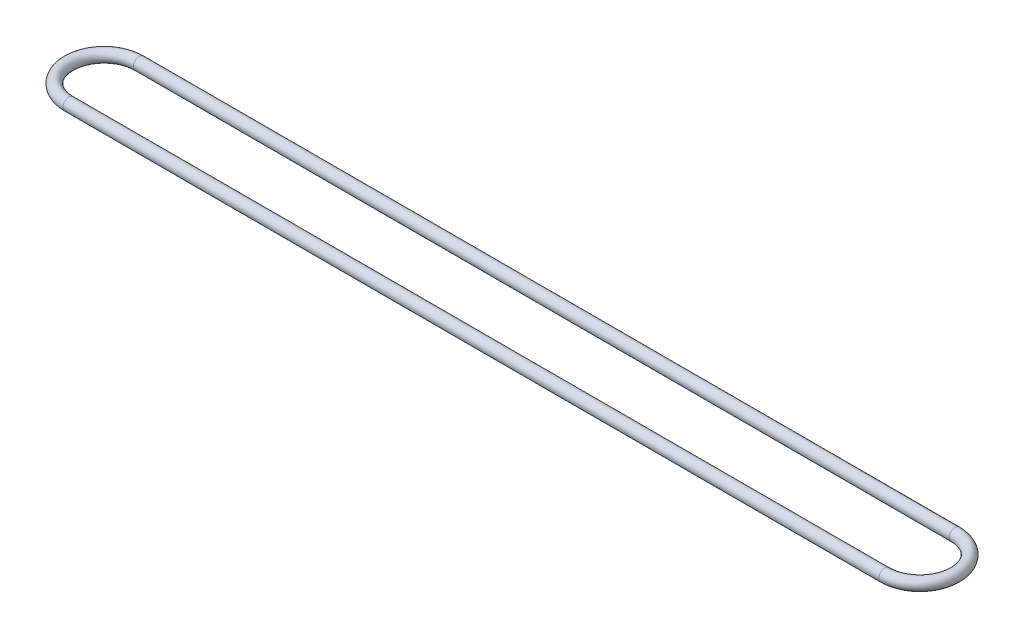
ISO-10303-21;
HEADER;
FILE_DESCRIPTION(('STEP AP214'),'2;1');
FILE_NAME('part.step','',(''),(''),'','','');
FILE_SCHEMA(('AUTOMOTIVE_DESIGN { 1 0 10303 214 1 1 1 1 }'));
ENDSEC;
DATA;
#1=APPLICATION_CONTEXT('core data for automotive mechanical design processes');
#2=APPLICATION_PROTOCOL_DEFINITION('international standard','automotive_design',2000,#1);
#3=PRODUCT_CONTEXT('',#1,'mechanical');
#4=PRODUCT('Part','Part','',(#3));
#5=PRODUCT_RELATED_PRODUCT_CATEGORY('part','',(#4));
#6=PRODUCT_DEFINITION_FORMATION('','',#4);
#7=PRODUCT_DEFINITION_CONTEXT('part definition',#1,'design');
#8=PRODUCT_DEFINITION('design','',#6,#7);
#9=PRODUCT_DEFINITION_SHAPE('','',#8);
#10=(LENGTH_UNIT() NAMED_UNIT(*) SI_UNIT(.MILLI.,.METRE.));
#11=(NAMED_UNIT(*) PLANE_ANGLE_UNIT() SI_UNIT($,.RADIAN.));
#12=(NAMED_UNIT(*) SI_UNIT($,.STERADIAN.) SOLID_ANGLE_UNIT());
#13=UNCERTAINTY_MEASURE_WITH_UNIT(LENGTH_MEASURE(1.E-05),#10,'distance_accuracy_value','');
#14=(GEOMETRIC_REPRESENTATION_CONTEXT(3) GLOBAL_UNCERTAINTY_ASSIGNED_CONTEXT((#13)) GLOBAL_UNIT_ASSIGNED_CONTEXT((#10,
#11,#12)) REPRESENTATION_CONTEXT('',''));
#15=CARTESIAN_POINT('',(0.,0.,0.));
#16=DIRECTION('',(0.,0.,1.));
#17=DIRECTION('',(1.,0.,0.));
#18=AXIS2_PLACEMENT_3D('',#15,#16,#17);
#19=CARTESIAN_POINT('',(0.,0.,38.82898));
#20=DIRECTION('',(0.,1.,0.));
#21=DIRECTION('',(0.,0.,1.));
#22=AXIS2_PLACEMENT_3D('',#19,#20,#21);
#23=TOROIDAL_SURFACE('',#22,38.82898,6.556375);
#24=CARTESIAN_POINT('',(0.,0.,0.));
#25=DIRECTION('',(-1.,0.,0.));
#26=DIRECTION('',(0.,0.,1.));
#27=AXIS2_PLACEMENT_3D('',#24,#25,#26);
#28=CIRCLE('',#27,6.556375);
#29=CARTESIAN_POINT('',(0.,0.,-6.556375));
#30=VERTEX_POINT('',#29);
#31=EDGE_CURVE('E70',#30,#30,#28,.F.);
#32=CARTESIAN_POINT('',(0.,0.,77.65796));
#33=DIRECTION('',(-1.,0.,0.));
#34=DIRECTION('',(0.,0.,1.));
#35=AXIS2_PLACEMENT_3D('',#32,#33,#34);
#36=CIRCLE('',#35,6.556375);
#37=CARTESIAN_POINT('',(0.,0.,84.214335));
#38=VERTEX_POINT('',#37);
#39=EDGE_CURVE('E66',#38,#38,#36,.T.);
#40=CARTESIAN_POINT('',(0.,0.,38.82898));
#41=DIRECTION('',(0.,1.,0.));
#42=DIRECTION('',(0.,0.,1.));
#43=AXIS2_PLACEMENT_3D('',#40,#41,#42);
#44=CIRCLE('',#43,45.385355);
#45=EDGE_CURVE('',#30,#38,#44,.T.);
#46=ORIENTED_EDGE('',*,*,#31,.F.);
#47=ORIENTED_EDGE('',*,*,#39,.T.);
#48=ORIENTED_EDGE('',*,*,#45,.T.);
#49=ORIENTED_EDGE('',*,*,#45,.F.);
#50=EDGE_LOOP('',(#46,#48,#47,#49));
#51=FACE_BOUND('',#50,.T.);
#52=ADVANCED_FACE('F36',(#51),#23,.T.);
#53=CARTESIAN_POINT('',(0.,0.,77.65796));
#54=DIRECTION('',(1.,0.,0.));
#55=DIRECTION('',(0.,0.,-1.));
#56=AXIS2_PLACEMENT_3D('',#53,#54,#55);
#57=CYLINDRICAL_SURFACE('',#56,6.556375);
#58=CARTESIAN_POINT('',(900.24204,0.,77.65796));
#59=DIRECTION('',(1.,0.,0.));
#60=DIRECTION('',(0.,0.,-1.));
#61=AXIS2_PLACEMENT_3D('',#58,#59,#60);
#62=CIRCLE('',#61,6.556375);
#63=CARTESIAN_POINT('',(900.24204,0.,84.2143350000003));
#64=VERTEX_POINT('',#63);
#65=EDGE_CURVE('E62',#64,#64,#62,.F.);
#66=ORIENTED_EDGE('',*,*,#65,.T.);
#67=EDGE_LOOP('',(#66));
#68=FACE_BOUND('',#67,.T.);
#69=ORIENTED_EDGE('',*,*,#39,.F.);
#70=EDGE_LOOP('',(#69));
#71=FACE_BOUND('',#70,.T.);
#72=ADVANCED_FACE('F80',(#68,#71),#57,.T.);
#73=CARTESIAN_POINT('',(900.24204,0.,38.82898));
#74=DIRECTION('',(0.,1.,0.));
#75=DIRECTION('',(0.,0.,1.));
#76=AXIS2_PLACEMENT_3D('',#73,#74,#75);
#77=TOROIDAL_SURFACE('',#76,38.8289800000003,6.556375);
#78=CARTESIAN_POINT('',(900.24204,0.,-2.4980018054066E-13));
#79=DIRECTION('',(1.,0.,0.));
#80=DIRECTION('',(0.,0.,-1.));
#81=AXIS2_PLACEMENT_3D('',#78,#79,#80);
#82=CIRCLE('',#81,6.556375);
#83=CARTESIAN_POINT('',(900.24204,0.,-6.55637500000025));
#84=VERTEX_POINT('',#83);
#85=EDGE_CURVE('E53',#84,#84,#82,.T.);
#86=CARTESIAN_POINT('',(900.24204,0.,38.82898));
#87=DIRECTION('',(0.,1.,0.));
#88=DIRECTION('',(0.,0.,1.));
#89=AXIS2_PLACEMENT_3D('',#86,#87,#88);
#90=CIRCLE('',#89,45.3853550000003);
#91=EDGE_CURVE('',#64,#84,#90,.T.);
#92=ORIENTED_EDGE('',*,*,#65,.F.);
#93=ORIENTED_EDGE('',*,*,#85,.T.);
#94=ORIENTED_EDGE('',*,*,#91,.T.);
#95=ORIENTED_EDGE('',*,*,#91,.F.);
#96=EDGE_LOOP('',(#92,#94,#93,#95));
#97=FACE_BOUND('',#96,.T.);
#98=ADVANCED_FACE('F86',(#97),#77,.T.);
#99=CARTESIAN_POINT('',(900.24204,0.,-5.41233724504764E-13));
#100=DIRECTION('',(-1.,0.,0.));
#101=DIRECTION('',(0.,0.,1.));
#102=AXIS2_PLACEMENT_3D('',#99,#100,#101);
#103=CYLINDRICAL_SURFACE('',#102,6.556375);
#104=ORIENTED_EDGE('',*,*,#31,.T.);
#105=EDGE_LOOP('',(#104));
#106=FACE_BOUND('',#105,.T.);
#107=ORIENTED_EDGE('',*,*,#85,.F.);
#108=EDGE_LOOP('',(#107));
#109=FACE_BOUND('',#108,.T.);
#110=ADVANCED_FACE('F76',(#106,#109),#103,.T.);
#111=CLOSED_SHELL('',(#52,#72,#98,#110));
#112=CARTESIAN_POINT('',(0.,0.,38.82898));
#113=DIRECTION('',(0.,1.,0.));
#114=DIRECTION('',(0.,0.,1.));
#115=AXIS2_PLACEMENT_3D('',#112,#113,#114);
#116=TOROIDAL_SURFACE('',#115,38.82898,6.35);
#117=CARTESIAN_POINT('',(0.,0.,0.));
#118=DIRECTION('',(1.,0.,0.));
#119=DIRECTION('',(0.,0.,-1.));
#120=AXIS2_PLACEMENT_3D('',#117,#118,#119);
#121=CIRCLE('',#120,6.35);
#122=CARTESIAN_POINT('',(0.,0.,-6.35));
#123=VERTEX_POINT('',#122);
#124=EDGE_CURVE('E10',#123,#123,#121,.T.);
#125=CARTESIAN_POINT('',(0.,0.,77.65796));
#126=DIRECTION('',(-1.,0.,0.));
#127=DIRECTION('',(0.,0.,1.));
#128=AXIS2_PLACEMENT_3D('',#125,#126,#127);
#129=CIRCLE('',#128,6.35);
#130=CARTESIAN_POINT('',(0.,0.,84.00796));
#131=VERTEX_POINT('',#130);
#132=EDGE_CURVE('E40',#131,#131,#129,.T.);
#133=CARTESIAN_POINT('',(0.,0.,38.82898));
#134=DIRECTION('',(0.,1.,0.));
#135=DIRECTION('',(0.,0.,1.));
#136=AXIS2_PLACEMENT_3D('',#133,#134,#135);
#137=CIRCLE('',#136,45.17898);
#138=EDGE_CURVE('',#123,#131,#137,.T.);
#139=ORIENTED_EDGE('',*,*,#124,.T.);
#140=ORIENTED_EDGE('',*,*,#132,.F.);
#141=ORIENTED_EDGE('',*,*,#138,.T.);
#142=ORIENTED_EDGE('',*,*,#138,.F.);
#143=EDGE_LOOP('',(#139,#141,#140,#142));
#144=FACE_BOUND('',#143,.T.);
#145=ADVANCED_FACE('F93',(#144),#116,.F.);
#146=CARTESIAN_POINT('',(0.,0.,77.65796));
#147=DIRECTION('',(1.,0.,0.));
#148=DIRECTION('',(0.,0.,-1.));
#149=AXIS2_PLACEMENT_3D('',#146,#147,#148);
#150=CYLINDRICAL_SURFACE('',#149,6.35);
#151=CARTESIAN_POINT('',(900.24204,0.,77.65796));
#152=DIRECTION('',(-1.,0.,0.));
#153=DIRECTION('',(0.,0.,1.));
#154=AXIS2_PLACEMENT_3D('',#151,#152,#153);
#155=CIRCLE('',#154,6.35);
#156=CARTESIAN_POINT('',(900.24204,0.,84.0079600000003));
#157=VERTEX_POINT('',#156);
#158=EDGE_CURVE('E50',#157,#157,#155,.T.);
#159=ORIENTED_EDGE('',*,*,#158,.F.);
#160=EDGE_LOOP('',(#159));
#161=FACE_BOUND('',#160,.T.);
#162=ORIENTED_EDGE('',*,*,#132,.T.);
#163=EDGE_LOOP('',(#162));
#164=FACE_BOUND('',#163,.T.);
#165=ADVANCED_FACE('F96',(#161,#164),#150,.F.);
#166=CARTESIAN_POINT('',(900.24204,0.,38.82898));
#167=DIRECTION('',(0.,1.,0.));
#168=DIRECTION('',(0.,0.,1.));
#169=AXIS2_PLACEMENT_3D('',#166,#167,#168);
#170=TOROIDAL_SURFACE('',#169,38.8289800000003,6.35);
#171=CARTESIAN_POINT('',(900.24204,0.,-2.56739074444567E-13));
#172=DIRECTION('',(1.,0.,0.));
#173=DIRECTION('',(0.,0.,-1.));
#174=AXIS2_PLACEMENT_3D('',#171,#172,#173);
#175=CIRCLE('',#174,6.35);
#176=CARTESIAN_POINT('',(900.24204,0.,-6.35000000000025));
#177=VERTEX_POINT('',#176);
#178=EDGE_CURVE('E45',#177,#177,#175,.T.);
#179=CARTESIAN_POINT('',(900.24204,0.,38.82898));
#180=DIRECTION('',(0.,1.,0.));
#181=DIRECTION('',(0.,0.,1.));
#182=AXIS2_PLACEMENT_3D('',#179,#180,#181);
#183=CIRCLE('',#182,45.1789800000003);
#184=EDGE_CURVE('',#157,#177,#183,.T.);
#185=ORIENTED_EDGE('',*,*,#158,.T.);
#186=ORIENTED_EDGE('',*,*,#178,.F.);
#187=ORIENTED_EDGE('',*,*,#184,.T.);
#188=ORIENTED_EDGE('',*,*,#184,.F.);
#189=EDGE_LOOP('',(#185,#187,#186,#188));
#190=FACE_BOUND('',#189,.T.);
#191=ADVANCED_FACE('F100',(#190),#170,.F.);
#192=CARTESIAN_POINT('',(900.24204,0.,-5.41233724504764E-13));
#193=DIRECTION('',(-1.,0.,0.));
#194=DIRECTION('',(0.,0.,1.));
#195=AXIS2_PLACEMENT_3D('',#192,#193,#194);
#196=CYLINDRICAL_SURFACE('',#195,6.35);
#197=ORIENTED_EDGE('',*,*,#124,.F.);
#198=EDGE_LOOP('',(#197));
#199=FACE_BOUND('',#198,.T.);
#200=ORIENTED_EDGE('',*,*,#178,.T.);
#201=EDGE_LOOP('',(#200));
#202=FACE_BOUND('',#201,.T.);
#203=ADVANCED_FACE('F38',(#199,#202),#196,.F.);
#204=CLOSED_SHELL('',(#145,#165,#191,#203));
#205=ORIENTED_CLOSED_SHELL('',*,#204,.T.);
#206=BREP_WITH_VOIDS('B2',#111,(#205));
#207=ADVANCED_BREP_SHAPE_REPRESENTATION('',(#18,#206),#14);
#208=SHAPE_DEFINITION_REPRESENTATION(#9,#207);
ENDSEC;
END-ISO-10303-21;
